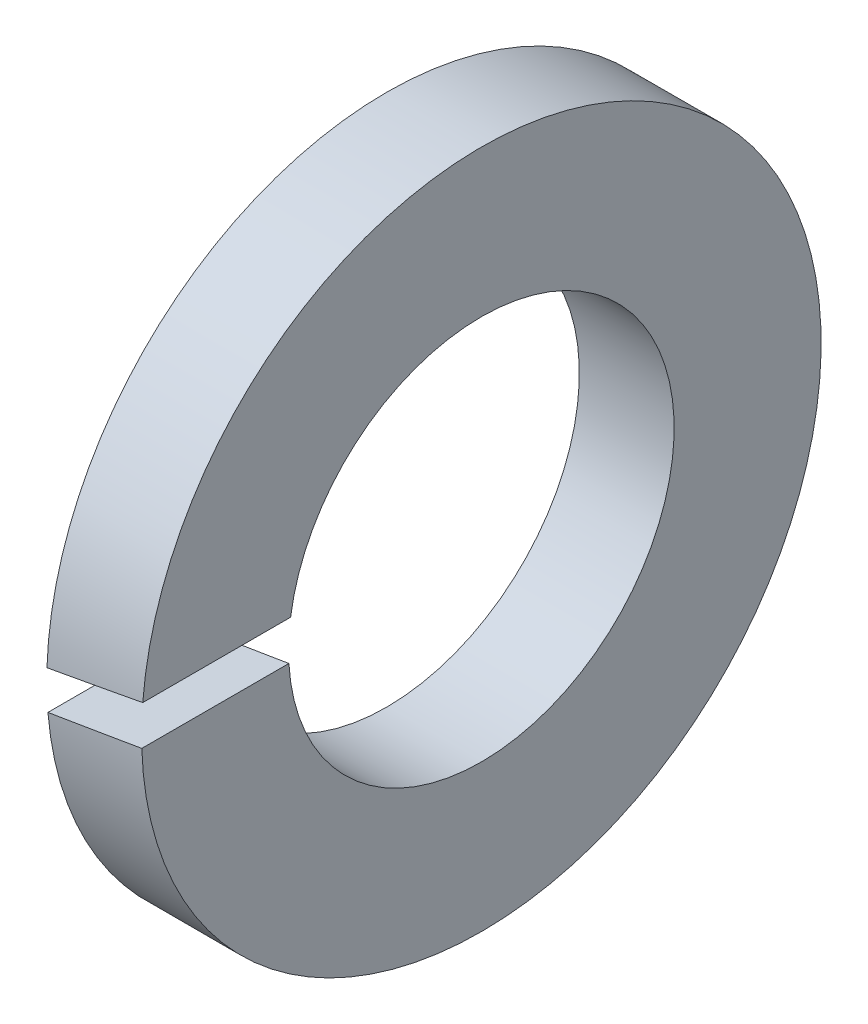
ISO-10303-21;
HEADER;
FILE_DESCRIPTION(('STEP AP214'),'2;1');
FILE_NAME('part.step','',(''),(''),'','','');
FILE_SCHEMA(('AUTOMOTIVE_DESIGN { 1 0 10303 214 1 1 1 1 }'));
ENDSEC;
DATA;
#1=APPLICATION_CONTEXT('core data for automotive mechanical design processes');
#2=APPLICATION_PROTOCOL_DEFINITION('international standard','automotive_design',2000,#1);
#3=PRODUCT_CONTEXT('',#1,'mechanical');
#4=PRODUCT('Part','Part','',(#3));
#5=PRODUCT_RELATED_PRODUCT_CATEGORY('part','',(#4));
#6=PRODUCT_DEFINITION_FORMATION('','',#4);
#7=PRODUCT_DEFINITION_CONTEXT('part definition',#1,'design');
#8=PRODUCT_DEFINITION('design','',#6,#7);
#9=PRODUCT_DEFINITION_SHAPE('','',#8);
#10=(LENGTH_UNIT() NAMED_UNIT(*) SI_UNIT(.MILLI.,.METRE.));
#11=(NAMED_UNIT(*) PLANE_ANGLE_UNIT() SI_UNIT($,.RADIAN.));
#12=(NAMED_UNIT(*) SI_UNIT($,.STERADIAN.) SOLID_ANGLE_UNIT());
#13=UNCERTAINTY_MEASURE_WITH_UNIT(LENGTH_MEASURE(1.E-05),#10,'distance_accuracy_value','');
#14=(GEOMETRIC_REPRESENTATION_CONTEXT(3) GLOBAL_UNCERTAINTY_ASSIGNED_CONTEXT((#13)) GLOBAL_UNIT_ASSIGNED_CONTEXT((#10,
#11,#12)) REPRESENTATION_CONTEXT('',''));
#15=CARTESIAN_POINT('',(0.,0.,0.));
#16=DIRECTION('',(0.,0.,1.));
#17=DIRECTION('',(1.,0.,0.));
#18=AXIS2_PLACEMENT_3D('',#15,#16,#17);
#19=CARTESIAN_POINT('',(1.5,8.425,0.));
#20=DIRECTION('',(1.,0.,0.));
#21=DIRECTION('',(0.,0.,-1.));
#22=AXIS2_PLACEMENT_3D('',#19,#20,#21);
#23=PLANE('',#22);
#24=CARTESIAN_POINT('',(1.5,0.,0.));
#25=DIRECTION('',(1.,0.,0.));
#26=DIRECTION('',(0.,0.,-1.));
#27=AXIS2_PLACEMENT_3D('',#24,#25,#26);
#28=CIRCLE('',#27,10.75);
#29=CARTESIAN_POINT('',(1.5,0.883900704313,10.7135997472799));
#30=VERTEX_POINT('',#29);
#31=CARTESIAN_POINT('',(1.5,-0.354919762187606,10.7441394240027));
#32=VERTEX_POINT('',#31);
#33=EDGE_CURVE('E67',#30,#32,#28,.F.);
#34=ORIENTED_EDGE('',*,*,#33,.F.);
#35=DIRECTION('',(0.,0.,1.));
#36=VECTOR('',#35,1.);
#37=CARTESIAN_POINT('',(1.5,0.883900704313,0.));
#38=LINE('',#37,#36);
#39=CARTESIAN_POINT('',(1.5,0.883900704313,6.03562089141747));
#40=VERTEX_POINT('',#39);
#41=EDGE_CURVE('E62',#30,#40,#38,.F.);
#42=ORIENTED_EDGE('',*,*,#41,.T.);
#43=CARTESIAN_POINT('',(1.5,0.,0.));
#44=DIRECTION('',(1.,0.,0.));
#45=DIRECTION('',(0.,0.,-1.));
#46=AXIS2_PLACEMENT_3D('',#43,#44,#45);
#47=CIRCLE('',#46,6.1);
#48=CARTESIAN_POINT('',(1.5,-0.354919762187606,6.08966599760682));
#49=VERTEX_POINT('',#48);
#50=EDGE_CURVE('E66',#40,#49,#47,.F.);
#51=ORIENTED_EDGE('',*,*,#50,.T.);
#52=DIRECTION('',(0.,0.,1.));
#53=VECTOR('',#52,1.);
#54=CARTESIAN_POINT('',(1.5,-0.354919762187606,0.));
#55=LINE('',#54,#53);
#56=EDGE_CURVE('E82',#49,#32,#55,.T.);
#57=ORIENTED_EDGE('',*,*,#56,.T.);
#58=EDGE_LOOP('',(#34,#42,#51,#57));
#59=FACE_BOUND('',#58,.T.);
#60=ADVANCED_FACE('F17',(#59),#23,.T.);
#61=CARTESIAN_POINT('',(-3.06034864741345,0.079788196336656,0.));
#62=DIRECTION('',(-0.17364817766693,0.984807753012208,0.));
#63=DIRECTION('',(-0.984807753012208,-0.17364817766693,0.));
#64=AXIS2_PLACEMENT_3D('',#61,#62,#63);
#65=PLANE('',#64);
#66=CARTESIAN_POINT('',(-3.51284999471762,0.,0.));
#67=DIRECTION('',(-0.17364817766693,0.984807753012208,0.));
#68=DIRECTION('',(0.984807753012208,0.17364817766693,0.));
#69=AXIS2_PLACEMENT_3D('',#66,#67,#68);
#70=ELLIPSE('',#69,61.9067826937942,10.75);
#71=CARTESIAN_POINT('',(-1.5,0.354919762187607,10.7441394240027));
#72=VERTEX_POINT('',#71);
#73=EDGE_CURVE('E20',#72,#30,#70,.T.);
#74=ORIENTED_EDGE('',*,*,#73,.F.);
#75=DIRECTION('',(0.,0.,1.));
#76=VECTOR('',#75,1.);
#77=CARTESIAN_POINT('',(-1.5,0.354919762187607,0.));
#78=LINE('',#77,#76);
#79=CARTESIAN_POINT('',(-1.5,0.354919762187607,6.08966599760682));
#80=VERTEX_POINT('',#79);
#81=EDGE_CURVE('E72',#80,#72,#78,.T.);
#82=ORIENTED_EDGE('',*,*,#81,.F.);
#83=CARTESIAN_POINT('',(-3.51284999471762,0.,0.));
#84=DIRECTION('',(-0.17364817766693,0.984807753012208,0.));
#85=DIRECTION('',(0.984807753012208,0.17364817766693,0.));
#86=AXIS2_PLACEMENT_3D('',#83,#84,#85);
#87=ELLIPSE('',#86,35.1284999471762,6.1);
#88=EDGE_CURVE('E70',#80,#40,#87,.T.);
#89=ORIENTED_EDGE('',*,*,#88,.T.);
#90=ORIENTED_EDGE('',*,*,#41,.F.);
#91=EDGE_LOOP('',(#74,#82,#89,#90));
#92=FACE_BOUND('',#91,.T.);
#93=ADVANCED_FACE('F71',(#92),#65,.F.);
#94=CARTESIAN_POINT('',(0.,0.,0.));
#95=DIRECTION('',(1.,0.,0.));
#96=DIRECTION('',(0.,0.,-1.));
#97=AXIS2_PLACEMENT_3D('',#94,#95,#96);
#98=CYLINDRICAL_SURFACE('',#97,10.75);
#99=CARTESIAN_POINT('',(3.51284999471762,0.,0.));
#100=DIRECTION('',(0.17364817766693,-0.984807753012208,0.));
#101=DIRECTION('',(0.984807753012208,0.17364817766693,0.));
#102=AXIS2_PLACEMENT_3D('',#99,#100,#101);
#103=ELLIPSE('',#102,61.9067826937942,10.75);
#104=CARTESIAN_POINT('',(-1.5,-0.883900704313001,10.7135997472799));
#105=VERTEX_POINT('',#104);
#106=EDGE_CURVE('E83',#32,#105,#103,.T.);
#107=ORIENTED_EDGE('',*,*,#106,.T.);
#108=CARTESIAN_POINT('',(-1.5,0.,0.));
#109=DIRECTION('',(1.,0.,0.));
#110=DIRECTION('',(0.,0.,-1.));
#111=AXIS2_PLACEMENT_3D('',#108,#109,#110);
#112=CIRCLE('',#111,10.75);
#113=EDGE_CURVE('E77',#72,#105,#112,.F.);
#114=ORIENTED_EDGE('',*,*,#113,.F.);
#115=ORIENTED_EDGE('',*,*,#73,.T.);
#116=ORIENTED_EDGE('',*,*,#33,.T.);
#117=EDGE_LOOP('',(#107,#114,#115,#116));
#118=FACE_BOUND('',#117,.T.);
#119=ADVANCED_FACE('F86',(#118),#98,.T.);
#120=CARTESIAN_POINT('',(3.06034864741345,-0.079788196336656,0.));
#121=DIRECTION('',(0.17364817766693,-0.984807753012208,0.));
#122=DIRECTION('',(0.984807753012208,0.17364817766693,0.));
#123=AXIS2_PLACEMENT_3D('',#120,#121,#122);
#124=PLANE('',#123);
#125=CARTESIAN_POINT('',(3.51284999471762,0.,0.));
#126=DIRECTION('',(0.17364817766693,-0.984807753012208,0.));
#127=DIRECTION('',(0.984807753012208,0.17364817766693,0.));
#128=AXIS2_PLACEMENT_3D('',#125,#126,#127);
#129=ELLIPSE('',#128,35.1284999471762,6.1);
#130=CARTESIAN_POINT('',(-1.5,-0.883900704313001,6.03562089141747));
#131=VERTEX_POINT('',#130);
#132=EDGE_CURVE('E35',#49,#131,#129,.T.);
#133=ORIENTED_EDGE('',*,*,#132,.T.);
#134=DIRECTION('',(0.,0.,1.));
#135=VECTOR('',#134,1.);
#136=CARTESIAN_POINT('',(-1.5,-0.883900704313002,0.));
#137=LINE('',#136,#135);
#138=EDGE_CURVE('E26',#105,#131,#137,.F.);
#139=ORIENTED_EDGE('',*,*,#138,.F.);
#140=ORIENTED_EDGE('',*,*,#106,.F.);
#141=ORIENTED_EDGE('',*,*,#56,.F.);
#142=EDGE_LOOP('',(#133,#139,#140,#141));
#143=FACE_BOUND('',#142,.T.);
#144=ADVANCED_FACE('F95',(#143),#124,.F.);
#145=CARTESIAN_POINT('',(0.,0.,0.));
#146=DIRECTION('',(1.,0.,0.));
#147=DIRECTION('',(0.,0.,-1.));
#148=AXIS2_PLACEMENT_3D('',#145,#146,#147);
#149=CYLINDRICAL_SURFACE('',#148,6.1);
#150=ORIENTED_EDGE('',*,*,#50,.F.);
#151=ORIENTED_EDGE('',*,*,#88,.F.);
#152=CARTESIAN_POINT('',(-1.5,0.,0.));
#153=DIRECTION('',(1.,0.,0.));
#154=DIRECTION('',(0.,0.,-1.));
#155=AXIS2_PLACEMENT_3D('',#152,#153,#154);
#156=CIRCLE('',#155,6.1);
#157=EDGE_CURVE('E11',#131,#80,#156,.T.);
#158=ORIENTED_EDGE('',*,*,#157,.F.);
#159=ORIENTED_EDGE('',*,*,#132,.F.);
#160=EDGE_LOOP('',(#150,#151,#158,#159));
#161=FACE_BOUND('',#160,.T.);
#162=ADVANCED_FACE('F75',(#161),#149,.F.);
#163=CARTESIAN_POINT('',(-1.5,8.425,0.));
#164=DIRECTION('',(-1.,0.,0.));
#165=DIRECTION('',(0.,0.,1.));
#166=AXIS2_PLACEMENT_3D('',#163,#164,#165);
#167=PLANE('',#166);
#168=ORIENTED_EDGE('',*,*,#157,.T.);
#169=ORIENTED_EDGE('',*,*,#81,.T.);
#170=ORIENTED_EDGE('',*,*,#113,.T.);
#171=ORIENTED_EDGE('',*,*,#138,.T.);
#172=EDGE_LOOP('',(#168,#169,#170,#171));
#173=FACE_BOUND('',#172,.T.);
#174=ADVANCED_FACE('F88',(#173),#167,.T.);
#175=CLOSED_SHELL('',(#60,#93,#119,#144,#162,#174));
#176=MANIFOLD_SOLID_BREP('B1',#175);
#177=ADVANCED_BREP_SHAPE_REPRESENTATION('',(#18,#176),#14);
#178=SHAPE_DEFINITION_REPRESENTATION(#9,#177);
ENDSEC;
END-ISO-10303-21;
